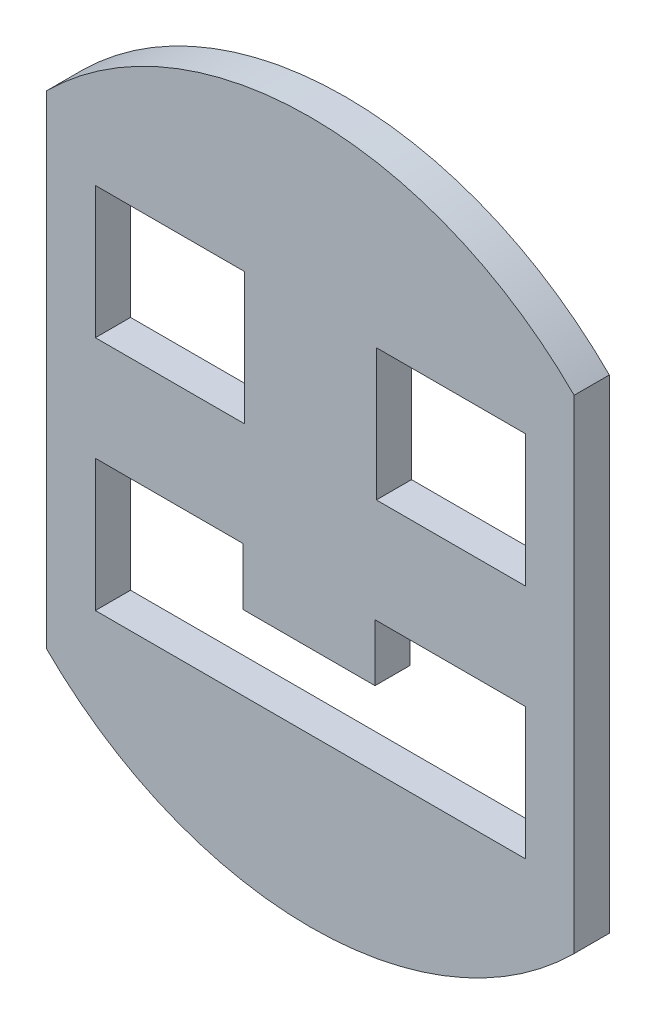
ISO-10303-21;
HEADER;
FILE_DESCRIPTION(('STEP AP214'),'2;1');
FILE_NAME('part.step','',(''),(''),'','','');
FILE_SCHEMA(('AUTOMOTIVE_DESIGN { 1 0 10303 214 1 1 1 1 }'));
ENDSEC;
DATA;
#1=APPLICATION_CONTEXT('core data for automotive mechanical design processes');
#2=APPLICATION_PROTOCOL_DEFINITION('international standard','automotive_design',2000,#1);
#3=PRODUCT_CONTEXT('',#1,'mechanical');
#4=PRODUCT('Part','Part','',(#3));
#5=PRODUCT_RELATED_PRODUCT_CATEGORY('part','',(#4));
#6=PRODUCT_DEFINITION_FORMATION('','',#4);
#7=PRODUCT_DEFINITION_CONTEXT('part definition',#1,'design');
#8=PRODUCT_DEFINITION('design','',#6,#7);
#9=PRODUCT_DEFINITION_SHAPE('','',#8);
#10=(LENGTH_UNIT() NAMED_UNIT(*) SI_UNIT(.MILLI.,.METRE.));
#11=(NAMED_UNIT(*) PLANE_ANGLE_UNIT() SI_UNIT($,.RADIAN.));
#12=(NAMED_UNIT(*) SI_UNIT($,.STERADIAN.) SOLID_ANGLE_UNIT());
#13=UNCERTAINTY_MEASURE_WITH_UNIT(LENGTH_MEASURE(1.E-05),#10,'distance_accuracy_value','');
#14=(GEOMETRIC_REPRESENTATION_CONTEXT(3) GLOBAL_UNCERTAINTY_ASSIGNED_CONTEXT((#13)) GLOBAL_UNIT_ASSIGNED_CONTEXT((#10,
#11,#12)) REPRESENTATION_CONTEXT('',''));
#15=CARTESIAN_POINT('',(0.,0.,0.));
#16=DIRECTION('',(0.,0.,1.));
#17=DIRECTION('',(1.,0.,0.));
#18=AXIS2_PLACEMENT_3D('',#15,#16,#17);
#19=CARTESIAN_POINT('',(108.919644627067,-13.125,10.));
#20=DIRECTION('',(0.,-1.,0.));
#21=DIRECTION('',(0.,0.,-1.));
#22=AXIS2_PLACEMENT_3D('',#19,#20,#21);
#23=PLANE('',#22);
#24=DIRECTION('',(-1.,0.,0.));
#25=VECTOR('',#24,1.);
#26=CARTESIAN_POINT('',(108.919644627067,-13.125,0.));
#27=LINE('',#26,#25);
#28=CARTESIAN_POINT('',(45.,-13.125,0.));
#29=VERTEX_POINT('',#28);
#30=CARTESIAN_POINT('',(11.0803553729329,-13.125,0.));
#31=VERTEX_POINT('',#30);
#32=EDGE_CURVE('E195',#29,#31,#27,.T.);
#33=ORIENTED_EDGE('',*,*,#32,.F.);
#34=DIRECTION('',(0.,0.,-1.));
#35=VECTOR('',#34,1.);
#36=CARTESIAN_POINT('',(45.,-13.125,0.));
#37=LINE('',#36,#35);
#38=CARTESIAN_POINT('',(45.,-13.125,8.));
#39=VERTEX_POINT('',#38);
#40=EDGE_CURVE('E178',#39,#29,#37,.T.);
#41=ORIENTED_EDGE('',*,*,#40,.F.);
#42=DIRECTION('',(-1.,0.,0.));
#43=VECTOR('',#42,1.);
#44=CARTESIAN_POINT('',(60.,-13.125,8.));
#45=LINE('',#44,#43);
#46=CARTESIAN_POINT('',(11.0803553729329,-13.125,8.));
#47=VERTEX_POINT('',#46);
#48=EDGE_CURVE('E186',#39,#47,#45,.T.);
#49=ORIENTED_EDGE('',*,*,#48,.T.);
#50=DIRECTION('',(0.,0.,-1.));
#51=VECTOR('',#50,1.);
#52=CARTESIAN_POINT('',(11.0803553729329,-13.125,10.));
#53=LINE('',#52,#51);
#54=EDGE_CURVE('E228',#47,#31,#53,.T.);
#55=ORIENTED_EDGE('',*,*,#54,.T.);
#56=EDGE_LOOP('',(#33,#41,#49,#55));
#57=FACE_BOUND('',#56,.T.);
#58=ADVANCED_FACE('F33',(#57),#23,.T.);
#59=CARTESIAN_POINT('',(108.919644627067,-13.125,8.));
#60=VERTEX_POINT('',#59);
#61=CARTESIAN_POINT('',(75.,-13.125,8.));
#62=VERTEX_POINT('',#61);
#63=EDGE_CURVE('E193',#60,#62,#45,.T.);
#64=ORIENTED_EDGE('',*,*,#63,.T.);
#65=DIRECTION('',(0.,0.,1.));
#66=VECTOR('',#65,1.);
#67=CARTESIAN_POINT('',(75.,-13.125,8.));
#68=LINE('',#67,#66);
#69=CARTESIAN_POINT('',(75.,-13.125,0.));
#70=VERTEX_POINT('',#69);
#71=EDGE_CURVE('E197',#70,#62,#68,.T.);
#72=ORIENTED_EDGE('',*,*,#71,.F.);
#73=CARTESIAN_POINT('',(108.919644627067,-13.125,0.));
#74=VERTEX_POINT('',#73);
#75=EDGE_CURVE('E216',#74,#70,#27,.T.);
#76=ORIENTED_EDGE('',*,*,#75,.F.);
#77=DIRECTION('',(0.,0.,-1.));
#78=VECTOR('',#77,1.);
#79=CARTESIAN_POINT('',(108.919644627067,-13.125,10.));
#80=LINE('',#79,#78);
#81=EDGE_CURVE('E226',#60,#74,#80,.T.);
#82=ORIENTED_EDGE('',*,*,#81,.F.);
#83=EDGE_LOOP('',(#64,#72,#76,#82));
#84=FACE_BOUND('',#83,.T.);
#85=ADVANCED_FACE('F350',(#84),#23,.T.);
#86=CARTESIAN_POINT('',(60.,-60.2079728939615,8.));
#87=DIRECTION('',(0.,0.,-1.));
#88=DIRECTION('',(-1.,0.,0.));
#89=AXIS2_PLACEMENT_3D('',#86,#87,#88);
#90=CYLINDRICAL_SURFACE('',#89,85.);
#91=CARTESIAN_POINT('',(60.,-60.2079728939615,0.));
#92=DIRECTION('',(0.,0.,1.));
#93=DIRECTION('',(-1.,0.,0.));
#94=AXIS2_PLACEMENT_3D('',#91,#92,#93);
#95=CIRCLE('',#94,85.);
#96=CARTESIAN_POINT('',(120.,0.,0.));
#97=VERTEX_POINT('',#96);
#98=CARTESIAN_POINT('',(0.,0.,0.));
#99=VERTEX_POINT('',#98);
#100=EDGE_CURVE('E300',#97,#99,#95,.T.);
#101=ORIENTED_EDGE('',*,*,#100,.T.);
#102=DIRECTION('',(0.,0.,-1.));
#103=VECTOR('',#102,1.);
#104=CARTESIAN_POINT('',(0.,0.,8.));
#105=LINE('',#104,#103);
#106=CARTESIAN_POINT('',(0.,0.,8.));
#107=VERTEX_POINT('',#106);
#108=EDGE_CURVE('E11',#107,#99,#105,.T.);
#109=ORIENTED_EDGE('',*,*,#108,.F.);
#110=CARTESIAN_POINT('',(60.,-60.2079728939615,8.));
#111=DIRECTION('',(0.,0.,1.));
#112=DIRECTION('',(-1.,0.,0.));
#113=AXIS2_PLACEMENT_3D('',#110,#111,#112);
#114=CIRCLE('',#113,85.);
#115=CARTESIAN_POINT('',(120.,0.,8.));
#116=VERTEX_POINT('',#115);
#117=EDGE_CURVE('E301',#116,#107,#114,.T.);
#118=ORIENTED_EDGE('',*,*,#117,.F.);
#119=DIRECTION('',(0.,0.,-1.));
#120=VECTOR('',#119,1.);
#121=CARTESIAN_POINT('',(120.,0.,8.));
#122=LINE('',#121,#120);
#123=EDGE_CURVE('E311',#116,#97,#122,.T.);
#124=ORIENTED_EDGE('',*,*,#123,.T.);
#125=EDGE_LOOP('',(#101,#109,#118,#124));
#126=FACE_BOUND('',#125,.T.);
#127=ADVANCED_FACE('F35',(#126),#90,.T.);
#128=CARTESIAN_POINT('',(0.,0.,8.));
#129=DIRECTION('',(1.,0.,0.));
#130=DIRECTION('',(0.,1.,0.));
#131=AXIS2_PLACEMENT_3D('',#128,#129,#130);
#132=PLANE('',#131);
#133=DIRECTION('',(0.,-1.,0.));
#134=VECTOR('',#133,1.);
#135=CARTESIAN_POINT('',(0.,0.,0.));
#136=LINE('',#135,#134);
#137=CARTESIAN_POINT('',(0.,-110.,0.));
#138=VERTEX_POINT('',#137);
#139=EDGE_CURVE('E314',#99,#138,#136,.T.);
#140=ORIENTED_EDGE('',*,*,#139,.T.);
#141=DIRECTION('',(0.,0.,-1.));
#142=VECTOR('',#141,1.);
#143=CARTESIAN_POINT('',(0.,-110.,8.));
#144=LINE('',#143,#142);
#145=CARTESIAN_POINT('',(0.,-110.,8.));
#146=VERTEX_POINT('',#145);
#147=EDGE_CURVE('E41',#146,#138,#144,.T.);
#148=ORIENTED_EDGE('',*,*,#147,.F.);
#149=DIRECTION('',(0.,-1.,0.));
#150=VECTOR('',#149,1.);
#151=CARTESIAN_POINT('',(0.,0.,8.));
#152=LINE('',#151,#150);
#153=EDGE_CURVE('E304',#107,#146,#152,.T.);
#154=ORIENTED_EDGE('',*,*,#153,.F.);
#155=ORIENTED_EDGE('',*,*,#108,.T.);
#156=EDGE_LOOP('',(#140,#148,#154,#155));
#157=FACE_BOUND('',#156,.T.);
#158=ADVANCED_FACE('F343',(#157),#132,.F.);
#159=CARTESIAN_POINT('',(60.,-49.7920271060385,8.));
#160=DIRECTION('',(0.,0.,-1.));
#161=DIRECTION('',(-1.,0.,0.));
#162=AXIS2_PLACEMENT_3D('',#159,#160,#161);
#163=CYLINDRICAL_SURFACE('',#162,85.);
#164=CARTESIAN_POINT('',(60.,-49.7920271060385,0.));
#165=DIRECTION('',(0.,0.,1.));
#166=DIRECTION('',(1.,0.,0.));
#167=AXIS2_PLACEMENT_3D('',#164,#165,#166);
#168=CIRCLE('',#167,85.);
#169=CARTESIAN_POINT('',(120.,-110.,0.));
#170=VERTEX_POINT('',#169);
#171=EDGE_CURVE('E316',#138,#170,#168,.T.);
#172=ORIENTED_EDGE('',*,*,#171,.T.);
#173=DIRECTION('',(0.,0.,-1.));
#174=VECTOR('',#173,1.);
#175=CARTESIAN_POINT('',(120.,-110.,8.));
#176=LINE('',#175,#174);
#177=CARTESIAN_POINT('',(120.,-110.,8.));
#178=VERTEX_POINT('',#177);
#179=EDGE_CURVE('E321',#178,#170,#176,.T.);
#180=ORIENTED_EDGE('',*,*,#179,.F.);
#181=CARTESIAN_POINT('',(60.,-49.7920271060385,8.));
#182=DIRECTION('',(0.,0.,1.));
#183=DIRECTION('',(1.,0.,0.));
#184=AXIS2_PLACEMENT_3D('',#181,#182,#183);
#185=CIRCLE('',#184,85.);
#186=EDGE_CURVE('E307',#146,#178,#185,.T.);
#187=ORIENTED_EDGE('',*,*,#186,.F.);
#188=ORIENTED_EDGE('',*,*,#147,.T.);
#189=EDGE_LOOP('',(#172,#180,#187,#188));
#190=FACE_BOUND('',#189,.T.);
#191=ADVANCED_FACE('F328',(#190),#163,.T.);
#192=CARTESIAN_POINT('',(120.,-110.,8.));
#193=DIRECTION('',(-1.,0.,0.));
#194=DIRECTION('',(0.,-1.,0.));
#195=AXIS2_PLACEMENT_3D('',#192,#193,#194);
#196=PLANE('',#195);
#197=DIRECTION('',(0.,1.,0.));
#198=VECTOR('',#197,1.);
#199=CARTESIAN_POINT('',(120.,-110.,0.));
#200=LINE('',#199,#198);
#201=EDGE_CURVE('E305',#170,#97,#200,.T.);
#202=ORIENTED_EDGE('',*,*,#201,.T.);
#203=ORIENTED_EDGE('',*,*,#123,.F.);
#204=DIRECTION('',(0.,1.,0.));
#205=VECTOR('',#204,1.);
#206=CARTESIAN_POINT('',(120.,-110.,8.));
#207=LINE('',#206,#205);
#208=EDGE_CURVE('E309',#178,#116,#207,.T.);
#209=ORIENTED_EDGE('',*,*,#208,.F.);
#210=ORIENTED_EDGE('',*,*,#179,.T.);
#211=EDGE_LOOP('',(#202,#203,#209,#210));
#212=FACE_BOUND('',#211,.T.);
#213=ADVANCED_FACE('F337',(#212),#196,.F.);
#214=CARTESIAN_POINT('',(60.,-60.2079728939615,8.));
#215=DIRECTION('',(0.,0.,-1.));
#216=DIRECTION('',(-1.,0.,0.));
#217=AXIS2_PLACEMENT_3D('',#214,#215,#216);
#218=PLANE('',#217);
#219=ORIENTED_EDGE('',*,*,#48,.F.);
#220=DIRECTION('',(0.,-1.,0.));
#221=VECTOR('',#220,1.);
#222=CARTESIAN_POINT('',(45.,-60.2079728939615,8.));
#223=LINE('',#222,#221);
#224=CARTESIAN_POINT('',(45.,-43.125,8.));
#225=VERTEX_POINT('',#224);
#226=EDGE_CURVE('E174',#39,#225,#223,.T.);
#227=ORIENTED_EDGE('',*,*,#226,.T.);
#228=DIRECTION('',(-1.,0.,0.));
#229=VECTOR('',#228,1.);
#230=CARTESIAN_POINT('',(60.,-43.125,8.));
#231=LINE('',#230,#229);
#232=CARTESIAN_POINT('',(11.0803553729329,-43.125,8.));
#233=VERTEX_POINT('',#232);
#234=EDGE_CURVE('E182',#225,#233,#231,.T.);
#235=ORIENTED_EDGE('',*,*,#234,.T.);
#236=DIRECTION('',(0.,1.,0.));
#237=VECTOR('',#236,1.);
#238=CARTESIAN_POINT('',(11.0803553729329,-60.2079728939615,8.));
#239=LINE('',#238,#237);
#240=EDGE_CURVE('E189',#233,#47,#239,.T.);
#241=ORIENTED_EDGE('',*,*,#240,.T.);
#242=EDGE_LOOP('',(#219,#227,#235,#241));
#243=FACE_BOUND('',#242,.T.);
#244=DIRECTION('',(0.,1.,0.));
#245=VECTOR('',#244,1.);
#246=CARTESIAN_POINT('',(108.919644627067,-60.2079728939615,8.));
#247=LINE('',#246,#245);
#248=CARTESIAN_POINT('',(108.919644627067,-43.125,8.));
#249=VERTEX_POINT('',#248);
#250=EDGE_CURVE('E295',#249,#60,#247,.T.);
#251=ORIENTED_EDGE('',*,*,#250,.F.);
#252=DIRECTION('',(-1.,0.,0.));
#253=VECTOR('',#252,1.);
#254=CARTESIAN_POINT('',(60.,-43.125,8.));
#255=LINE('',#254,#253);
#256=CARTESIAN_POINT('',(75.,-43.125,8.));
#257=VERTEX_POINT('',#256);
#258=EDGE_CURVE('E297',#249,#257,#255,.T.);
#259=ORIENTED_EDGE('',*,*,#258,.T.);
#260=DIRECTION('',(0.,1.,0.));
#261=VECTOR('',#260,1.);
#262=CARTESIAN_POINT('',(74.9999999999999,-60.2079728939615,8.));
#263=LINE('',#262,#261);
#264=EDGE_CURVE('E183',#257,#62,#263,.T.);
#265=ORIENTED_EDGE('',*,*,#264,.T.);
#266=ORIENTED_EDGE('',*,*,#63,.F.);
#267=EDGE_LOOP('',(#251,#259,#265,#266));
#268=FACE_BOUND('',#267,.T.);
#269=DIRECTION('',(-1.,0.,0.));
#270=VECTOR('',#269,1.);
#271=CARTESIAN_POINT('',(60.,-66.875,8.));
#272=LINE('',#271,#270);
#273=CARTESIAN_POINT('',(108.919644627067,-66.875,8.));
#274=VERTEX_POINT('',#273);
#275=CARTESIAN_POINT('',(74.695581191482,-66.875,8.));
#276=VERTEX_POINT('',#275);
#277=EDGE_CURVE('E286',#274,#276,#272,.T.);
#278=ORIENTED_EDGE('',*,*,#277,.F.);
#279=DIRECTION('',(0.,-1.,0.));
#280=VECTOR('',#279,1.);
#281=CARTESIAN_POINT('',(108.919644627067,-60.2079728939615,8.));
#282=LINE('',#281,#280);
#283=CARTESIAN_POINT('',(108.919644627067,-96.875,8.));
#284=VERTEX_POINT('',#283);
#285=EDGE_CURVE('E288',#274,#284,#282,.T.);
#286=ORIENTED_EDGE('',*,*,#285,.T.);
#287=DIRECTION('',(-1.,0.,0.));
#288=VECTOR('',#287,1.);
#289=CARTESIAN_POINT('',(60.,-96.875,8.));
#290=LINE('',#289,#288);
#291=CARTESIAN_POINT('',(11.0803553729329,-96.875,8.));
#292=VERTEX_POINT('',#291);
#293=EDGE_CURVE('E225',#284,#292,#290,.T.);
#294=ORIENTED_EDGE('',*,*,#293,.T.);
#295=DIRECTION('',(0.,-1.,0.));
#296=VECTOR('',#295,1.);
#297=CARTESIAN_POINT('',(11.0803553729329,-60.2079728939615,8.));
#298=LINE('',#297,#296);
#299=CARTESIAN_POINT('',(11.0803553729329,-66.875,8.));
#300=VERTEX_POINT('',#299);
#301=EDGE_CURVE('E272',#300,#292,#298,.T.);
#302=ORIENTED_EDGE('',*,*,#301,.F.);
#303=DIRECTION('',(-1.,0.,0.));
#304=VECTOR('',#303,1.);
#305=CARTESIAN_POINT('',(60.,-66.875,8.));
#306=LINE('',#305,#304);
#307=CARTESIAN_POINT('',(44.695581191482,-66.875,8.));
#308=VERTEX_POINT('',#307);
#309=EDGE_CURVE('E275',#308,#300,#306,.T.);
#310=ORIENTED_EDGE('',*,*,#309,.F.);
#311=DIRECTION('',(0.,-1.,0.));
#312=VECTOR('',#311,1.);
#313=CARTESIAN_POINT('',(44.695581191482,-60.2079728939614,8.));
#314=LINE('',#313,#312);
#315=CARTESIAN_POINT('',(44.695581191482,-79.875,8.));
#316=VERTEX_POINT('',#315);
#317=EDGE_CURVE('E277',#308,#316,#314,.T.);
#318=ORIENTED_EDGE('',*,*,#317,.T.);
#319=DIRECTION('',(1.,0.,0.));
#320=VECTOR('',#319,1.);
#321=CARTESIAN_POINT('',(60.,-79.875,8.));
#322=LINE('',#321,#320);
#323=CARTESIAN_POINT('',(74.695581191482,-79.875,8.));
#324=VERTEX_POINT('',#323);
#325=EDGE_CURVE('E280',#316,#324,#322,.T.);
#326=ORIENTED_EDGE('',*,*,#325,.T.);
#327=DIRECTION('',(0.,1.,0.));
#328=VECTOR('',#327,1.);
#329=CARTESIAN_POINT('',(74.695581191482,-60.2079728939615,8.));
#330=LINE('',#329,#328);
#331=EDGE_CURVE('E283',#324,#276,#330,.T.);
#332=ORIENTED_EDGE('',*,*,#331,.T.);
#333=EDGE_LOOP('',(#278,#286,#294,#302,#310,#318,#326,#332));
#334=FACE_BOUND('',#333,.T.);
#335=ORIENTED_EDGE('',*,*,#117,.T.);
#336=ORIENTED_EDGE('',*,*,#153,.T.);
#337=ORIENTED_EDGE('',*,*,#186,.T.);
#338=ORIENTED_EDGE('',*,*,#208,.T.);
#339=EDGE_LOOP('',(#335,#336,#337,#338));
#340=FACE_BOUND('',#339,.T.);
#341=ADVANCED_FACE('F187',(#243,#268,#334,#340),#218,.F.);
#342=CARTESIAN_POINT('',(60.,-60.2079728939615,0.));
#343=DIRECTION('',(0.,0.,-1.));
#344=DIRECTION('',(-1.,0.,0.));
#345=AXIS2_PLACEMENT_3D('',#342,#343,#344);
#346=PLANE('',#345);
#347=CARTESIAN_POINT('',(101.291584920164,-1.06483934552584,0.));
#348=DIRECTION('',(0.,0.,-1.));
#349=DIRECTION('',(-1.,0.,0.));
#350=AXIS2_PLACEMENT_3D('',#347,#348,#349);
#351=CIRCLE('',#350,2.49999999999999);
#352=CARTESIAN_POINT('',(98.7915849201637,-1.06483934552584,0.));
#353=VERTEX_POINT('',#352);
#354=EDGE_CURVE('E741',#353,#353,#351,.T.);
#355=ORIENTED_EDGE('',*,*,#354,.F.);
#356=EDGE_LOOP('',(#355));
#357=FACE_BOUND('',#356,.T.);
#358=CARTESIAN_POINT('',(113.90625,-34.065,0.));
#359=DIRECTION('',(0.,0.,-1.));
#360=DIRECTION('',(-1.,0.,0.));
#361=AXIS2_PLACEMENT_3D('',#358,#359,#360);
#362=CIRCLE('',#361,2.49999999999998);
#363=CARTESIAN_POINT('',(111.40625,-34.065,0.));
#364=VERTEX_POINT('',#363);
#365=EDGE_CURVE('E740',#364,#364,#362,.T.);
#366=ORIENTED_EDGE('',*,*,#365,.F.);
#367=EDGE_LOOP('',(#366));
#368=FACE_BOUND('',#367,.T.);
#369=CARTESIAN_POINT('',(113.90625,-75.94,0.));
#370=DIRECTION('',(0.,0.,-1.));
#371=DIRECTION('',(-1.,0.,0.));
#372=AXIS2_PLACEMENT_3D('',#369,#370,#371);
#373=CIRCLE('',#372,2.50000000000001);
#374=CARTESIAN_POINT('',(111.40625,-75.94,0.));
#375=VERTEX_POINT('',#374);
#376=EDGE_CURVE('E790',#375,#375,#373,.T.);
#377=ORIENTED_EDGE('',*,*,#376,.F.);
#378=EDGE_LOOP('',(#377));
#379=FACE_BOUND('',#378,.T.);
#380=CARTESIAN_POINT('',(101.291584920164,-117.382967976618,0.));
#381=DIRECTION('',(0.,0.,-1.));
#382=DIRECTION('',(-1.,0.,0.));
#383=AXIS2_PLACEMENT_3D('',#380,#381,#382);
#384=CIRCLE('',#383,2.50000000000001);
#385=CARTESIAN_POINT('',(98.7915849201636,-117.382967976618,0.));
#386=VERTEX_POINT('',#385);
#387=EDGE_CURVE('E784',#386,#386,#384,.T.);
#388=ORIENTED_EDGE('',*,*,#387,.F.);
#389=EDGE_LOOP('',(#388));
#390=FACE_BOUND('',#389,.T.);
#391=CARTESIAN_POINT('',(60.,-129.382503442067,0.));
#392=DIRECTION('',(0.,0.,-1.));
#393=DIRECTION('',(-1.,0.,0.));
#394=AXIS2_PLACEMENT_3D('',#391,#392,#393);
#395=CIRCLE('',#394,2.5);
#396=CARTESIAN_POINT('',(57.5,-129.382503442067,0.));
#397=VERTEX_POINT('',#396);
#398=EDGE_CURVE('E778',#397,#397,#395,.T.);
#399=ORIENTED_EDGE('',*,*,#398,.F.);
#400=EDGE_LOOP('',(#399));
#401=FACE_BOUND('',#400,.T.);
#402=CARTESIAN_POINT('',(18.7084150798364,-117.382967976618,0.));
#403=DIRECTION('',(0.,0.,-1.));
#404=DIRECTION('',(-1.,0.,0.));
#405=AXIS2_PLACEMENT_3D('',#402,#403,#404);
#406=CIRCLE('',#405,2.50000000000001);
#407=CARTESIAN_POINT('',(16.2084150798364,-117.382967976618,0.));
#408=VERTEX_POINT('',#407);
#409=EDGE_CURVE('E772',#408,#408,#406,.T.);
#410=ORIENTED_EDGE('',*,*,#409,.F.);
#411=EDGE_LOOP('',(#410));
#412=FACE_BOUND('',#411,.T.);
#413=CARTESIAN_POINT('',(6.09375,-75.94,0.));
#414=DIRECTION('',(0.,0.,-1.));
#415=DIRECTION('',(-1.,0.,0.));
#416=AXIS2_PLACEMENT_3D('',#413,#414,#415);
#417=CIRCLE('',#416,2.5);
#418=CARTESIAN_POINT('',(3.59375,-75.94,0.));
#419=VERTEX_POINT('',#418);
#420=EDGE_CURVE('E766',#419,#419,#417,.T.);
#421=ORIENTED_EDGE('',*,*,#420,.F.);
#422=EDGE_LOOP('',(#421));
#423=FACE_BOUND('',#422,.T.);
#424=CARTESIAN_POINT('',(6.09375,-34.065,0.));
#425=DIRECTION('',(0.,0.,-1.));
#426=DIRECTION('',(-1.,0.,0.));
#427=AXIS2_PLACEMENT_3D('',#424,#425,#426);
#428=CIRCLE('',#427,2.5);
#429=CARTESIAN_POINT('',(3.59375,-34.065,0.));
#430=VERTEX_POINT('',#429);
#431=EDGE_CURVE('E757',#430,#430,#428,.T.);
#432=ORIENTED_EDGE('',*,*,#431,.F.);
#433=EDGE_LOOP('',(#432));
#434=FACE_BOUND('',#433,.T.);
#435=CARTESIAN_POINT('',(18.7084150798364,-1.06483934552584,0.));
#436=DIRECTION('',(0.,0.,-1.));
#437=DIRECTION('',(-1.,0.,0.));
#438=AXIS2_PLACEMENT_3D('',#435,#436,#437);
#439=CIRCLE('',#438,2.5);
#440=CARTESIAN_POINT('',(16.2084150798364,-1.06483934552584,0.));
#441=VERTEX_POINT('',#440);
#442=EDGE_CURVE('E751',#441,#441,#439,.T.);
#443=ORIENTED_EDGE('',*,*,#442,.F.);
#444=EDGE_LOOP('',(#443));
#445=FACE_BOUND('',#444,.T.);
#446=DIRECTION('',(0.,-1.,0.));
#447=VECTOR('',#446,1.);
#448=CARTESIAN_POINT('',(45.,-30.6089671162724,0.));
#449=LINE('',#448,#447);
#450=CARTESIAN_POINT('',(45.,-43.125,0.));
#451=VERTEX_POINT('',#450);
#452=EDGE_CURVE('E48',#29,#451,#449,.T.);
#453=ORIENTED_EDGE('',*,*,#452,.F.);
#454=ORIENTED_EDGE('',*,*,#32,.T.);
#455=DIRECTION('',(0.,1.,0.));
#456=VECTOR('',#455,1.);
#457=CARTESIAN_POINT('',(11.0803553729329,-43.125,0.));
#458=LINE('',#457,#456);
#459=CARTESIAN_POINT('',(11.0803553729329,-43.125,0.));
#460=VERTEX_POINT('',#459);
#461=EDGE_CURVE('E213',#460,#31,#458,.T.);
#462=ORIENTED_EDGE('',*,*,#461,.F.);
#463=DIRECTION('',(-1.,0.,0.));
#464=VECTOR('',#463,1.);
#465=CARTESIAN_POINT('',(45.,-43.125,0.));
#466=LINE('',#465,#464);
#467=EDGE_CURVE('E210',#451,#460,#466,.T.);
#468=ORIENTED_EDGE('',*,*,#467,.F.);
#469=EDGE_LOOP('',(#453,#454,#462,#468));
#470=FACE_BOUND('',#469,.T.);
#471=DIRECTION('',(-1.,0.,0.));
#472=VECTOR('',#471,1.);
#473=CARTESIAN_POINT('',(108.919644627067,-43.125,0.));
#474=LINE('',#473,#472);
#475=CARTESIAN_POINT('',(108.919644627067,-43.125,0.));
#476=VERTEX_POINT('',#475);
#477=CARTESIAN_POINT('',(75.,-43.125,0.));
#478=VERTEX_POINT('',#477);
#479=EDGE_CURVE('E205',#476,#478,#474,.T.);
#480=ORIENTED_EDGE('',*,*,#479,.F.);
#481=DIRECTION('',(0.,1.,0.));
#482=VECTOR('',#481,1.);
#483=CARTESIAN_POINT('',(108.919644627067,-43.125,0.));
#484=LINE('',#483,#482);
#485=EDGE_CURVE('E219',#476,#74,#484,.T.);
#486=ORIENTED_EDGE('',*,*,#485,.T.);
#487=ORIENTED_EDGE('',*,*,#75,.T.);
#488=DIRECTION('',(0.,1.,0.));
#489=VECTOR('',#488,1.);
#490=CARTESIAN_POINT('',(75.,-43.125,0.));
#491=LINE('',#490,#489);
#492=EDGE_CURVE('E56',#478,#70,#491,.T.);
#493=ORIENTED_EDGE('',*,*,#492,.F.);
#494=EDGE_LOOP('',(#480,#486,#487,#493));
#495=FACE_BOUND('',#494,.T.);
#496=DIRECTION('',(0.,-1.,0.));
#497=VECTOR('',#496,1.);
#498=CARTESIAN_POINT('',(108.919644627067,-66.875,0.));
#499=LINE('',#498,#497);
#500=CARTESIAN_POINT('',(108.919644627067,-66.875,0.));
#501=VERTEX_POINT('',#500);
#502=CARTESIAN_POINT('',(108.919644627067,-96.875,0.));
#503=VERTEX_POINT('',#502);
#504=EDGE_CURVE('E207',#501,#503,#499,.T.);
#505=ORIENTED_EDGE('',*,*,#504,.F.);
#506=DIRECTION('',(-1.,0.,0.));
#507=VECTOR('',#506,1.);
#508=CARTESIAN_POINT('',(108.919644627067,-66.875,0.));
#509=LINE('',#508,#507);
#510=CARTESIAN_POINT('',(74.695581191482,-66.875,0.));
#511=VERTEX_POINT('',#510);
#512=EDGE_CURVE('E237',#501,#511,#509,.T.);
#513=ORIENTED_EDGE('',*,*,#512,.T.);
#514=DIRECTION('',(0.,1.,0.));
#515=VECTOR('',#514,1.);
#516=CARTESIAN_POINT('',(74.695581191482,-79.875,0.));
#517=LINE('',#516,#515);
#518=CARTESIAN_POINT('',(74.695581191482,-79.875,0.));
#519=VERTEX_POINT('',#518);
#520=EDGE_CURVE('E251',#519,#511,#517,.T.);
#521=ORIENTED_EDGE('',*,*,#520,.F.);
#522=DIRECTION('',(1.,0.,0.));
#523=VECTOR('',#522,1.);
#524=CARTESIAN_POINT('',(44.695581191482,-79.875,0.));
#525=LINE('',#524,#523);
#526=CARTESIAN_POINT('',(44.695581191482,-79.875,0.));
#527=VERTEX_POINT('',#526);
#528=EDGE_CURVE('E254',#527,#519,#525,.T.);
#529=ORIENTED_EDGE('',*,*,#528,.F.);
#530=DIRECTION('',(0.,-1.,0.));
#531=VECTOR('',#530,1.);
#532=CARTESIAN_POINT('',(44.695581191482,-66.875,0.));
#533=LINE('',#532,#531);
#534=CARTESIAN_POINT('',(44.695581191482,-66.875,0.));
#535=VERTEX_POINT('',#534);
#536=EDGE_CURVE('E257',#535,#527,#533,.T.);
#537=ORIENTED_EDGE('',*,*,#536,.F.);
#538=DIRECTION('',(-1.,0.,0.));
#539=VECTOR('',#538,1.);
#540=CARTESIAN_POINT('',(44.695581191482,-66.875,0.));
#541=LINE('',#540,#539);
#542=CARTESIAN_POINT('',(11.0803553729329,-66.875,0.));
#543=VERTEX_POINT('',#542);
#544=EDGE_CURVE('E260',#535,#543,#541,.T.);
#545=ORIENTED_EDGE('',*,*,#544,.T.);
#546=DIRECTION('',(0.,-1.,0.));
#547=VECTOR('',#546,1.);
#548=CARTESIAN_POINT('',(11.0803553729329,-66.875,0.));
#549=LINE('',#548,#547);
#550=CARTESIAN_POINT('',(11.0803553729329,-96.875,0.));
#551=VERTEX_POINT('',#550);
#552=EDGE_CURVE('E263',#543,#551,#549,.T.);
#553=ORIENTED_EDGE('',*,*,#552,.T.);
#554=DIRECTION('',(-1.,0.,0.));
#555=VECTOR('',#554,1.);
#556=CARTESIAN_POINT('',(108.919644627067,-96.875,0.));
#557=LINE('',#556,#555);
#558=EDGE_CURVE('E266',#503,#551,#557,.T.);
#559=ORIENTED_EDGE('',*,*,#558,.F.);
#560=EDGE_LOOP('',(#505,#513,#521,#529,#537,#545,#553,#559));
#561=FACE_BOUND('',#560,.T.);
#562=ORIENTED_EDGE('',*,*,#100,.F.);
#563=ORIENTED_EDGE('',*,*,#201,.F.);
#564=ORIENTED_EDGE('',*,*,#171,.F.);
#565=ORIENTED_EDGE('',*,*,#139,.F.);
#566=EDGE_LOOP('',(#562,#563,#564,#565));
#567=FACE_BOUND('',#566,.T.);
#568=ADVANCED_FACE('F334',(#357,#368,#379,#390,#401,#412,#423,#434,#445,#470,#495,#561,#567),
#346,.T.);
#569=CARTESIAN_POINT('',(108.919644627067,-66.875,10.));
#570=DIRECTION('',(1.,0.,0.));
#571=DIRECTION('',(0.,1.,0.));
#572=AXIS2_PLACEMENT_3D('',#569,#570,#571);
#573=PLANE('',#572);
#574=DIRECTION('',(0.,0.,-1.));
#575=VECTOR('',#574,1.);
#576=CARTESIAN_POINT('',(108.919644627067,-66.875,10.));
#577=LINE('',#576,#575);
#578=EDGE_CURVE('E196',#274,#501,#577,.T.);
#579=ORIENTED_EDGE('',*,*,#578,.T.);
#580=ORIENTED_EDGE('',*,*,#504,.T.);
#581=DIRECTION('',(0.,0.,-1.));
#582=VECTOR('',#581,1.);
#583=CARTESIAN_POINT('',(108.919644627067,-96.875,10.));
#584=LINE('',#583,#582);
#585=EDGE_CURVE('E234',#284,#503,#584,.T.);
#586=ORIENTED_EDGE('',*,*,#585,.F.);
#587=ORIENTED_EDGE('',*,*,#285,.F.);
#588=EDGE_LOOP('',(#579,#580,#586,#587));
#589=FACE_BOUND('',#588,.T.);
#590=ADVANCED_FACE('F380',(#589),#573,.F.);
#591=CARTESIAN_POINT('',(108.919644627067,-66.875,10.));
#592=DIRECTION('',(0.,-1.,0.));
#593=DIRECTION('',(0.,0.,-1.));
#594=AXIS2_PLACEMENT_3D('',#591,#592,#593);
#595=PLANE('',#594);
#596=ORIENTED_EDGE('',*,*,#277,.T.);
#597=DIRECTION('',(0.,0.,-1.));
#598=VECTOR('',#597,1.);
#599=CARTESIAN_POINT('',(74.695581191482,-66.875,10.));
#600=LINE('',#599,#598);
#601=EDGE_CURVE('E199',#276,#511,#600,.T.);
#602=ORIENTED_EDGE('',*,*,#601,.T.);
#603=ORIENTED_EDGE('',*,*,#512,.F.);
#604=ORIENTED_EDGE('',*,*,#578,.F.);
#605=EDGE_LOOP('',(#596,#602,#603,#604));
#606=FACE_BOUND('',#605,.T.);
#607=ADVANCED_FACE('F383',(#606),#595,.T.);
#608=CARTESIAN_POINT('',(74.695581191482,-79.875,10.));
#609=DIRECTION('',(-1.,0.,0.));
#610=DIRECTION('',(0.,-1.,0.));
#611=AXIS2_PLACEMENT_3D('',#608,#609,#610);
#612=PLANE('',#611);
#613=DIRECTION('',(0.,0.,-1.));
#614=VECTOR('',#613,1.);
#615=CARTESIAN_POINT('',(74.695581191482,-79.875,10.));
#616=LINE('',#615,#614);
#617=EDGE_CURVE('E246',#324,#519,#616,.T.);
#618=ORIENTED_EDGE('',*,*,#617,.T.);
#619=ORIENTED_EDGE('',*,*,#520,.T.);
#620=ORIENTED_EDGE('',*,*,#601,.F.);
#621=ORIENTED_EDGE('',*,*,#331,.F.);
#622=EDGE_LOOP('',(#618,#619,#620,#621));
#623=FACE_BOUND('',#622,.T.);
#624=ADVANCED_FACE('F403',(#623),#612,.F.);
#625=CARTESIAN_POINT('',(44.695581191482,-79.875,10.));
#626=DIRECTION('',(0.,1.,0.));
#627=DIRECTION('',(-1.,0.,0.));
#628=AXIS2_PLACEMENT_3D('',#625,#626,#627);
#629=PLANE('',#628);
#630=DIRECTION('',(0.,0.,-1.));
#631=VECTOR('',#630,1.);
#632=CARTESIAN_POINT('',(44.695581191482,-79.875,10.));
#633=LINE('',#632,#631);
#634=EDGE_CURVE('E244',#316,#527,#633,.T.);
#635=ORIENTED_EDGE('',*,*,#634,.T.);
#636=ORIENTED_EDGE('',*,*,#528,.T.);
#637=ORIENTED_EDGE('',*,*,#617,.F.);
#638=ORIENTED_EDGE('',*,*,#325,.F.);
#639=EDGE_LOOP('',(#635,#636,#637,#638));
#640=FACE_BOUND('',#639,.T.);
#641=ADVANCED_FACE('F399',(#640),#629,.F.);
#642=CARTESIAN_POINT('',(44.695581191482,-66.875,10.));
#643=DIRECTION('',(1.,0.,0.));
#644=DIRECTION('',(0.,1.,0.));
#645=AXIS2_PLACEMENT_3D('',#642,#643,#644);
#646=PLANE('',#645);
#647=DIRECTION('',(0.,0.,-1.));
#648=VECTOR('',#647,1.);
#649=CARTESIAN_POINT('',(44.695581191482,-66.875,10.));
#650=LINE('',#649,#648);
#651=EDGE_CURVE('E242',#308,#535,#650,.T.);
#652=ORIENTED_EDGE('',*,*,#651,.T.);
#653=ORIENTED_EDGE('',*,*,#536,.T.);
#654=ORIENTED_EDGE('',*,*,#634,.F.);
#655=ORIENTED_EDGE('',*,*,#317,.F.);
#656=EDGE_LOOP('',(#652,#653,#654,#655));
#657=FACE_BOUND('',#656,.T.);
#658=ADVANCED_FACE('F395',(#657),#646,.F.);
#659=CARTESIAN_POINT('',(44.695581191482,-66.875,10.));
#660=DIRECTION('',(0.,-1.,0.));
#661=DIRECTION('',(0.,0.,-1.));
#662=AXIS2_PLACEMENT_3D('',#659,#660,#661);
#663=PLANE('',#662);
#664=ORIENTED_EDGE('',*,*,#309,.T.);
#665=DIRECTION('',(0.,0.,-1.));
#666=VECTOR('',#665,1.);
#667=CARTESIAN_POINT('',(11.0803553729329,-66.875,10.));
#668=LINE('',#667,#666);
#669=EDGE_CURVE('E240',#300,#543,#668,.T.);
#670=ORIENTED_EDGE('',*,*,#669,.T.);
#671=ORIENTED_EDGE('',*,*,#544,.F.);
#672=ORIENTED_EDGE('',*,*,#651,.F.);
#673=EDGE_LOOP('',(#664,#670,#671,#672));
#674=FACE_BOUND('',#673,.T.);
#675=ADVANCED_FACE('F391',(#674),#663,.T.);
#676=CARTESIAN_POINT('',(11.0803553729329,-66.875,10.));
#677=DIRECTION('',(1.,0.,0.));
#678=DIRECTION('',(0.,0.,-1.));
#679=AXIS2_PLACEMENT_3D('',#676,#677,#678);
#680=PLANE('',#679);
#681=ORIENTED_EDGE('',*,*,#301,.T.);
#682=DIRECTION('',(0.,0.,-1.));
#683=VECTOR('',#682,1.);
#684=CARTESIAN_POINT('',(11.0803553729329,-96.875,10.));
#685=LINE('',#684,#683);
#686=EDGE_CURVE('E238',#292,#551,#685,.T.);
#687=ORIENTED_EDGE('',*,*,#686,.T.);
#688=ORIENTED_EDGE('',*,*,#552,.F.);
#689=ORIENTED_EDGE('',*,*,#669,.F.);
#690=EDGE_LOOP('',(#681,#687,#688,#689));
#691=FACE_BOUND('',#690,.T.);
#692=ADVANCED_FACE('F387',(#691),#680,.T.);
#693=CARTESIAN_POINT('',(108.919644627067,-96.875,10.));
#694=DIRECTION('',(0.,-1.,0.));
#695=DIRECTION('',(0.,0.,-1.));
#696=AXIS2_PLACEMENT_3D('',#693,#694,#695);
#697=PLANE('',#696);
#698=ORIENTED_EDGE('',*,*,#585,.T.);
#699=ORIENTED_EDGE('',*,*,#558,.T.);
#700=ORIENTED_EDGE('',*,*,#686,.F.);
#701=ORIENTED_EDGE('',*,*,#293,.F.);
#702=EDGE_LOOP('',(#698,#699,#700,#701));
#703=FACE_BOUND('',#702,.T.);
#704=ADVANCED_FACE('F378',(#703),#697,.F.);
#705=CARTESIAN_POINT('',(108.919644627067,-43.125,10.));
#706=DIRECTION('',(0.,-1.,0.));
#707=DIRECTION('',(0.,0.,-1.));
#708=AXIS2_PLACEMENT_3D('',#705,#706,#707);
#709=PLANE('',#708);
#710=DIRECTION('',(0.,0.,-1.));
#711=VECTOR('',#710,1.);
#712=CARTESIAN_POINT('',(108.919644627067,-43.125,10.));
#713=LINE('',#712,#711);
#714=EDGE_CURVE('E223',#249,#476,#713,.T.);
#715=ORIENTED_EDGE('',*,*,#714,.T.);
#716=ORIENTED_EDGE('',*,*,#479,.T.);
#717=DIRECTION('',(0.,0.,-1.));
#718=VECTOR('',#717,1.);
#719=CARTESIAN_POINT('',(75.,-43.125,10.));
#720=LINE('',#719,#718);
#721=EDGE_CURVE('E222',#257,#478,#720,.T.);
#722=ORIENTED_EDGE('',*,*,#721,.F.);
#723=ORIENTED_EDGE('',*,*,#258,.F.);
#724=EDGE_LOOP('',(#715,#716,#722,#723));
#725=FACE_BOUND('',#724,.T.);
#726=ADVANCED_FACE('F375',(#725),#709,.F.);
#727=CARTESIAN_POINT('',(108.919644627067,-43.125,10.));
#728=DIRECTION('',(-1.,0.,0.));
#729=DIRECTION('',(0.,-1.,0.));
#730=AXIS2_PLACEMENT_3D('',#727,#728,#729);
#731=PLANE('',#730);
#732=ORIENTED_EDGE('',*,*,#250,.T.);
#733=ORIENTED_EDGE('',*,*,#81,.T.);
#734=ORIENTED_EDGE('',*,*,#485,.F.);
#735=ORIENTED_EDGE('',*,*,#714,.F.);
#736=EDGE_LOOP('',(#732,#733,#734,#735));
#737=FACE_BOUND('',#736,.T.);
#738=ADVANCED_FACE('F359',(#737),#731,.T.);
#739=CARTESIAN_POINT('',(11.0803553729329,-43.125,10.));
#740=DIRECTION('',(-1.,0.,0.));
#741=DIRECTION('',(0.,0.,1.));
#742=AXIS2_PLACEMENT_3D('',#739,#740,#741);
#743=PLANE('',#742);
#744=DIRECTION('',(0.,0.,-1.));
#745=VECTOR('',#744,1.);
#746=CARTESIAN_POINT('',(11.0803553729329,-43.125,10.));
#747=LINE('',#746,#745);
#748=EDGE_CURVE('E230',#233,#460,#747,.T.);
#749=ORIENTED_EDGE('',*,*,#748,.T.);
#750=ORIENTED_EDGE('',*,*,#461,.T.);
#751=ORIENTED_EDGE('',*,*,#54,.F.);
#752=ORIENTED_EDGE('',*,*,#240,.F.);
#753=EDGE_LOOP('',(#749,#750,#751,#752));
#754=FACE_BOUND('',#753,.T.);
#755=ADVANCED_FACE('F361',(#754),#743,.F.);
#756=CARTESIAN_POINT('',(45.,-43.125,10.));
#757=DIRECTION('',(0.,-1.,0.));
#758=DIRECTION('',(1.,0.,0.));
#759=AXIS2_PLACEMENT_3D('',#756,#757,#758);
#760=PLANE('',#759);
#761=DIRECTION('',(0.,0.,-1.));
#762=VECTOR('',#761,1.);
#763=CARTESIAN_POINT('',(45.,-43.125,10.));
#764=LINE('',#763,#762);
#765=EDGE_CURVE('E179',#225,#451,#764,.T.);
#766=ORIENTED_EDGE('',*,*,#765,.T.);
#767=ORIENTED_EDGE('',*,*,#467,.T.);
#768=ORIENTED_EDGE('',*,*,#748,.F.);
#769=ORIENTED_EDGE('',*,*,#234,.F.);
#770=EDGE_LOOP('',(#766,#767,#768,#769));
#771=FACE_BOUND('',#770,.T.);
#772=ADVANCED_FACE('F364',(#771),#760,.F.);
#773=CARTESIAN_POINT('',(45.,-30.6089671162724,10.));
#774=DIRECTION('',(1.,0.,0.));
#775=DIRECTION('',(0.,0.,-1.));
#776=AXIS2_PLACEMENT_3D('',#773,#774,#775);
#777=PLANE('',#776);
#778=ORIENTED_EDGE('',*,*,#226,.F.);
#779=ORIENTED_EDGE('',*,*,#40,.T.);
#780=ORIENTED_EDGE('',*,*,#452,.T.);
#781=ORIENTED_EDGE('',*,*,#765,.F.);
#782=EDGE_LOOP('',(#778,#779,#780,#781));
#783=FACE_BOUND('',#782,.T.);
#784=ADVANCED_FACE('F176',(#783),#777,.F.);
#785=CARTESIAN_POINT('',(75.,-43.125,10.));
#786=DIRECTION('',(-1.,0.,0.));
#787=DIRECTION('',(0.,-1.,0.));
#788=AXIS2_PLACEMENT_3D('',#785,#786,#787);
#789=PLANE('',#788);
#790=ORIENTED_EDGE('',*,*,#721,.T.);
#791=ORIENTED_EDGE('',*,*,#492,.T.);
#792=ORIENTED_EDGE('',*,*,#71,.T.);
#793=ORIENTED_EDGE('',*,*,#264,.F.);
#794=EDGE_LOOP('',(#790,#791,#792,#793));
#795=FACE_BOUND('',#794,.T.);
#796=ADVANCED_FACE('F371',(#795),#789,.F.);
#797=CARTESIAN_POINT('',(18.7084150798364,-1.06483934552584,3.));
#798=DIRECTION('',(0.,0.,-1.));
#799=DIRECTION('',(-1.,0.,0.));
#800=AXIS2_PLACEMENT_3D('',#797,#798,#799);
#801=CYLINDRICAL_SURFACE('',#800,2.5);
#802=CARTESIAN_POINT('',(18.7084150798364,-1.06483934552584,3.));
#803=DIRECTION('',(0.,0.,-1.));
#804=DIRECTION('',(-1.,0.,0.));
#805=AXIS2_PLACEMENT_3D('',#802,#803,#804);
#806=CIRCLE('',#805,2.5);
#807=CARTESIAN_POINT('',(16.2084150798364,-1.06483934552584,3.));
#808=VERTEX_POINT('',#807);
#809=EDGE_CURVE('E201',#808,#808,#806,.T.);
#810=ORIENTED_EDGE('',*,*,#809,.F.);
#811=EDGE_LOOP('',(#810));
#812=FACE_BOUND('',#811,.T.);
#813=ORIENTED_EDGE('',*,*,#442,.T.);
#814=EDGE_LOOP('',(#813));
#815=FACE_BOUND('',#814,.T.);
#816=ADVANCED_FACE('F374',(#812,#815),#801,.F.);
#817=CARTESIAN_POINT('',(18.7084150798364,-1.06483934552584,3.));
#818=DIRECTION('',(0.,0.,-1.));
#819=DIRECTION('',(-1.,0.,0.));
#820=AXIS2_PLACEMENT_3D('',#817,#818,#819);
#821=PLANE('',#820);
#822=ORIENTED_EDGE('',*,*,#809,.T.);
#823=EDGE_LOOP('',(#822));
#824=FACE_BOUND('',#823,.T.);
#825=ADVANCED_FACE('F494',(#824),#821,.T.);
#826=CARTESIAN_POINT('',(6.09375,-34.065,3.));
#827=DIRECTION('',(0.,0.,-1.));
#828=DIRECTION('',(-1.,0.,0.));
#829=AXIS2_PLACEMENT_3D('',#826,#827,#828);
#830=CYLINDRICAL_SURFACE('',#829,2.5);
#831=CARTESIAN_POINT('',(6.09375,-34.065,3.));
#832=DIRECTION('',(0.,0.,-1.));
#833=DIRECTION('',(-1.,0.,0.));
#834=AXIS2_PLACEMENT_3D('',#831,#832,#833);
#835=CIRCLE('',#834,2.5);
#836=CARTESIAN_POINT('',(3.59375,-34.065,3.));
#837=VERTEX_POINT('',#836);
#838=EDGE_CURVE('E753',#837,#837,#835,.T.);
#839=ORIENTED_EDGE('',*,*,#838,.F.);
#840=EDGE_LOOP('',(#839));
#841=FACE_BOUND('',#840,.T.);
#842=ORIENTED_EDGE('',*,*,#431,.T.);
#843=EDGE_LOOP('',(#842));
#844=FACE_BOUND('',#843,.T.);
#845=ADVANCED_FACE('F501',(#841,#844),#830,.F.);
#846=CARTESIAN_POINT('',(6.09375,-34.065,3.));
#847=DIRECTION('',(0.,0.,-1.));
#848=DIRECTION('',(-1.,0.,0.));
#849=AXIS2_PLACEMENT_3D('',#846,#847,#848);
#850=PLANE('',#849);
#851=ORIENTED_EDGE('',*,*,#838,.T.);
#852=EDGE_LOOP('',(#851));
#853=FACE_BOUND('',#852,.T.);
#854=ADVANCED_FACE('F509',(#853),#850,.T.);
#855=CARTESIAN_POINT('',(6.09375,-75.94,3.));
#856=DIRECTION('',(0.,0.,-1.));
#857=DIRECTION('',(-1.,0.,0.));
#858=AXIS2_PLACEMENT_3D('',#855,#856,#857);
#859=CYLINDRICAL_SURFACE('',#858,2.5);
#860=CARTESIAN_POINT('',(6.09375,-75.94,3.));
#861=DIRECTION('',(0.,0.,-1.));
#862=DIRECTION('',(-1.,0.,0.));
#863=AXIS2_PLACEMENT_3D('',#860,#861,#862);
#864=CIRCLE('',#863,2.5);
#865=CARTESIAN_POINT('',(3.59375,-75.94,3.));
#866=VERTEX_POINT('',#865);
#867=EDGE_CURVE('E761',#866,#866,#864,.T.);
#868=ORIENTED_EDGE('',*,*,#867,.F.);
#869=EDGE_LOOP('',(#868));
#870=FACE_BOUND('',#869,.T.);
#871=ORIENTED_EDGE('',*,*,#420,.T.);
#872=EDGE_LOOP('',(#871));
#873=FACE_BOUND('',#872,.T.);
#874=ADVANCED_FACE('F517',(#870,#873),#859,.F.);
#875=CARTESIAN_POINT('',(6.09375,-75.94,3.));
#876=DIRECTION('',(0.,0.,-1.));
#877=DIRECTION('',(-1.,0.,0.));
#878=AXIS2_PLACEMENT_3D('',#875,#876,#877);
#879=PLANE('',#878);
#880=ORIENTED_EDGE('',*,*,#867,.T.);
#881=EDGE_LOOP('',(#880));
#882=FACE_BOUND('',#881,.T.);
#883=ADVANCED_FACE('F525',(#882),#879,.T.);
#884=CARTESIAN_POINT('',(18.7084150798364,-117.382967976618,3.));
#885=DIRECTION('',(0.,0.,-1.));
#886=DIRECTION('',(-1.,0.,0.));
#887=AXIS2_PLACEMENT_3D('',#884,#885,#886);
#888=CYLINDRICAL_SURFACE('',#887,2.50000000000001);
#889=CARTESIAN_POINT('',(18.7084150798364,-117.382967976618,3.));
#890=DIRECTION('',(0.,0.,-1.));
#891=DIRECTION('',(-1.,0.,0.));
#892=AXIS2_PLACEMENT_3D('',#889,#890,#891);
#893=CIRCLE('',#892,2.50000000000001);
#894=CARTESIAN_POINT('',(16.2084150798364,-117.382967976618,3.));
#895=VERTEX_POINT('',#894);
#896=EDGE_CURVE('E769',#895,#895,#893,.T.);
#897=ORIENTED_EDGE('',*,*,#896,.F.);
#898=EDGE_LOOP('',(#897));
#899=FACE_BOUND('',#898,.T.);
#900=ORIENTED_EDGE('',*,*,#409,.T.);
#901=EDGE_LOOP('',(#900));
#902=FACE_BOUND('',#901,.T.);
#903=ADVANCED_FACE('F533',(#899,#902),#888,.F.);
#904=CARTESIAN_POINT('',(18.7084150798364,-117.382967976618,3.));
#905=DIRECTION('',(0.,0.,-1.));
#906=DIRECTION('',(-1.,0.,0.));
#907=AXIS2_PLACEMENT_3D('',#904,#905,#906);
#908=PLANE('',#907);
#909=ORIENTED_EDGE('',*,*,#896,.T.);
#910=EDGE_LOOP('',(#909));
#911=FACE_BOUND('',#910,.T.);
#912=ADVANCED_FACE('F541',(#911),#908,.T.);
#913=CARTESIAN_POINT('',(60.,-129.382503442067,3.));
#914=DIRECTION('',(0.,0.,-1.));
#915=DIRECTION('',(-1.,0.,0.));
#916=AXIS2_PLACEMENT_3D('',#913,#914,#915);
#917=CYLINDRICAL_SURFACE('',#916,2.5);
#918=CARTESIAN_POINT('',(60.,-129.382503442067,3.));
#919=DIRECTION('',(0.,0.,-1.));
#920=DIRECTION('',(-1.,0.,0.));
#921=AXIS2_PLACEMENT_3D('',#918,#919,#920);
#922=CIRCLE('',#921,2.5);
#923=CARTESIAN_POINT('',(57.5,-129.382503442067,3.));
#924=VERTEX_POINT('',#923);
#925=EDGE_CURVE('E775',#924,#924,#922,.T.);
#926=ORIENTED_EDGE('',*,*,#925,.F.);
#927=EDGE_LOOP('',(#926));
#928=FACE_BOUND('',#927,.T.);
#929=ORIENTED_EDGE('',*,*,#398,.T.);
#930=EDGE_LOOP('',(#929));
#931=FACE_BOUND('',#930,.T.);
#932=ADVANCED_FACE('F549',(#928,#931),#917,.F.);
#933=CARTESIAN_POINT('',(60.,-129.382503442067,3.));
#934=DIRECTION('',(0.,0.,-1.));
#935=DIRECTION('',(-1.,0.,0.));
#936=AXIS2_PLACEMENT_3D('',#933,#934,#935);
#937=PLANE('',#936);
#938=ORIENTED_EDGE('',*,*,#925,.T.);
#939=EDGE_LOOP('',(#938));
#940=FACE_BOUND('',#939,.T.);
#941=ADVANCED_FACE('F557',(#940),#937,.T.);
#942=CARTESIAN_POINT('',(101.291584920164,-117.382967976618,3.));
#943=DIRECTION('',(0.,0.,-1.));
#944=DIRECTION('',(-1.,0.,0.));
#945=AXIS2_PLACEMENT_3D('',#942,#943,#944);
#946=CYLINDRICAL_SURFACE('',#945,2.50000000000001);
#947=CARTESIAN_POINT('',(101.291584920164,-117.382967976618,3.));
#948=DIRECTION('',(0.,0.,-1.));
#949=DIRECTION('',(-1.,0.,0.));
#950=AXIS2_PLACEMENT_3D('',#947,#948,#949);
#951=CIRCLE('',#950,2.50000000000001);
#952=CARTESIAN_POINT('',(98.7915849201636,-117.382967976618,3.));
#953=VERTEX_POINT('',#952);
#954=EDGE_CURVE('E781',#953,#953,#951,.T.);
#955=ORIENTED_EDGE('',*,*,#954,.F.);
#956=EDGE_LOOP('',(#955));
#957=FACE_BOUND('',#956,.T.);
#958=ORIENTED_EDGE('',*,*,#387,.T.);
#959=EDGE_LOOP('',(#958));
#960=FACE_BOUND('',#959,.T.);
#961=ADVANCED_FACE('F565',(#957,#960),#946,.F.);
#962=CARTESIAN_POINT('',(101.291584920164,-117.382967976618,3.));
#963=DIRECTION('',(0.,0.,-1.));
#964=DIRECTION('',(-1.,0.,0.));
#965=AXIS2_PLACEMENT_3D('',#962,#963,#964);
#966=PLANE('',#965);
#967=ORIENTED_EDGE('',*,*,#954,.T.);
#968=EDGE_LOOP('',(#967));
#969=FACE_BOUND('',#968,.T.);
#970=ADVANCED_FACE('F573',(#969),#966,.T.);
#971=CARTESIAN_POINT('',(113.90625,-75.94,3.));
#972=DIRECTION('',(0.,0.,-1.));
#973=DIRECTION('',(-1.,0.,0.));
#974=AXIS2_PLACEMENT_3D('',#971,#972,#973);
#975=CYLINDRICAL_SURFACE('',#974,2.50000000000001);
#976=CARTESIAN_POINT('',(113.90625,-75.94,3.));
#977=DIRECTION('',(0.,0.,-1.));
#978=DIRECTION('',(-1.,0.,0.));
#979=AXIS2_PLACEMENT_3D('',#976,#977,#978);
#980=CIRCLE('',#979,2.50000000000001);
#981=CARTESIAN_POINT('',(111.40625,-75.94,3.));
#982=VERTEX_POINT('',#981);
#983=EDGE_CURVE('E787',#982,#982,#980,.T.);
#984=ORIENTED_EDGE('',*,*,#983,.F.);
#985=EDGE_LOOP('',(#984));
#986=FACE_BOUND('',#985,.T.);
#987=ORIENTED_EDGE('',*,*,#376,.T.);
#988=EDGE_LOOP('',(#987));
#989=FACE_BOUND('',#988,.T.);
#990=ADVANCED_FACE('F581',(#986,#989),#975,.F.);
#991=CARTESIAN_POINT('',(113.90625,-75.94,3.));
#992=DIRECTION('',(0.,0.,-1.));
#993=DIRECTION('',(-1.,0.,0.));
#994=AXIS2_PLACEMENT_3D('',#991,#992,#993);
#995=PLANE('',#994);
#996=ORIENTED_EDGE('',*,*,#983,.T.);
#997=EDGE_LOOP('',(#996));
#998=FACE_BOUND('',#997,.T.);
#999=ADVANCED_FACE('F589',(#998),#995,.T.);
#1000=CARTESIAN_POINT('',(113.90625,-34.065,3.));
#1001=DIRECTION('',(0.,0.,-1.));
#1002=DIRECTION('',(-1.,0.,0.));
#1003=AXIS2_PLACEMENT_3D('',#1000,#1001,#1002);
#1004=CYLINDRICAL_SURFACE('',#1003,2.49999999999998);
#1005=CARTESIAN_POINT('',(113.90625,-34.065,3.));
#1006=DIRECTION('',(0.,0.,-1.));
#1007=DIRECTION('',(-1.,0.,0.));
#1008=AXIS2_PLACEMENT_3D('',#1005,#1006,#1007);
#1009=CIRCLE('',#1008,2.49999999999998);
#1010=CARTESIAN_POINT('',(111.40625,-34.065,3.));
#1011=VERTEX_POINT('',#1010);
#1012=EDGE_CURVE('E744',#1011,#1011,#1009,.T.);
#1013=ORIENTED_EDGE('',*,*,#1012,.F.);
#1014=EDGE_LOOP('',(#1013));
#1015=FACE_BOUND('',#1014,.T.);
#1016=ORIENTED_EDGE('',*,*,#365,.T.);
#1017=EDGE_LOOP('',(#1016));
#1018=FACE_BOUND('',#1017,.T.);
#1019=ADVANCED_FACE('F597',(#1015,#1018),#1004,.F.);
#1020=CARTESIAN_POINT('',(113.90625,-34.065,3.));
#1021=DIRECTION('',(0.,0.,-1.));
#1022=DIRECTION('',(-1.,0.,0.));
#1023=AXIS2_PLACEMENT_3D('',#1020,#1021,#1022);
#1024=PLANE('',#1023);
#1025=ORIENTED_EDGE('',*,*,#1012,.T.);
#1026=EDGE_LOOP('',(#1025));
#1027=FACE_BOUND('',#1026,.T.);
#1028=ADVANCED_FACE('F605',(#1027),#1024,.T.);
#1029=CARTESIAN_POINT('',(101.291584920164,-1.06483934552584,3.));
#1030=DIRECTION('',(0.,0.,-1.));
#1031=DIRECTION('',(-1.,0.,0.));
#1032=AXIS2_PLACEMENT_3D('',#1029,#1030,#1031);
#1033=CYLINDRICAL_SURFACE('',#1032,2.49999999999999);
#1034=CARTESIAN_POINT('',(101.291584920164,-1.06483934552584,3.));
#1035=DIRECTION('',(0.,0.,-1.));
#1036=DIRECTION('',(-1.,0.,0.));
#1037=AXIS2_PLACEMENT_3D('',#1034,#1035,#1036);
#1038=CIRCLE('',#1037,2.49999999999999);
#1039=CARTESIAN_POINT('',(98.7915849201637,-1.06483934552584,3.));
#1040=VERTEX_POINT('',#1039);
#1041=EDGE_CURVE('E739',#1040,#1040,#1038,.T.);
#1042=ORIENTED_EDGE('',*,*,#1041,.F.);
#1043=EDGE_LOOP('',(#1042));
#1044=FACE_BOUND('',#1043,.T.);
#1045=ORIENTED_EDGE('',*,*,#354,.T.);
#1046=EDGE_LOOP('',(#1045));
#1047=FACE_BOUND('',#1046,.T.);
#1048=ADVANCED_FACE('F613',(#1044,#1047),#1033,.F.);
#1049=CARTESIAN_POINT('',(101.291584920164,-1.06483934552584,3.));
#1050=DIRECTION('',(0.,0.,-1.));
#1051=DIRECTION('',(-1.,0.,0.));
#1052=AXIS2_PLACEMENT_3D('',#1049,#1050,#1051);
#1053=PLANE('',#1052);
#1054=ORIENTED_EDGE('',*,*,#1041,.T.);
#1055=EDGE_LOOP('',(#1054));
#1056=FACE_BOUND('',#1055,.T.);
#1057=ADVANCED_FACE('F621',(#1056),#1053,.T.);
#1058=CLOSED_SHELL('',(#58,#85,#127,#158,#191,#213,#341,#568,#590,#607,#624,#641,#658,#675,#692,
#704,#726,#738,#755,#772,#784,#796,#816,#825,#845,#854,#874,#883,#903,#912,#932,#941,#961,#970,
#990,#999,#1019,#1028,#1048,#1057));
#1059=MANIFOLD_SOLID_BREP('B2',#1058);
#1060=ADVANCED_BREP_SHAPE_REPRESENTATION('',(#18,#1059),#14);
#1061=SHAPE_DEFINITION_REPRESENTATION(#9,#1060);
ENDSEC;
END-ISO-10303-21;
